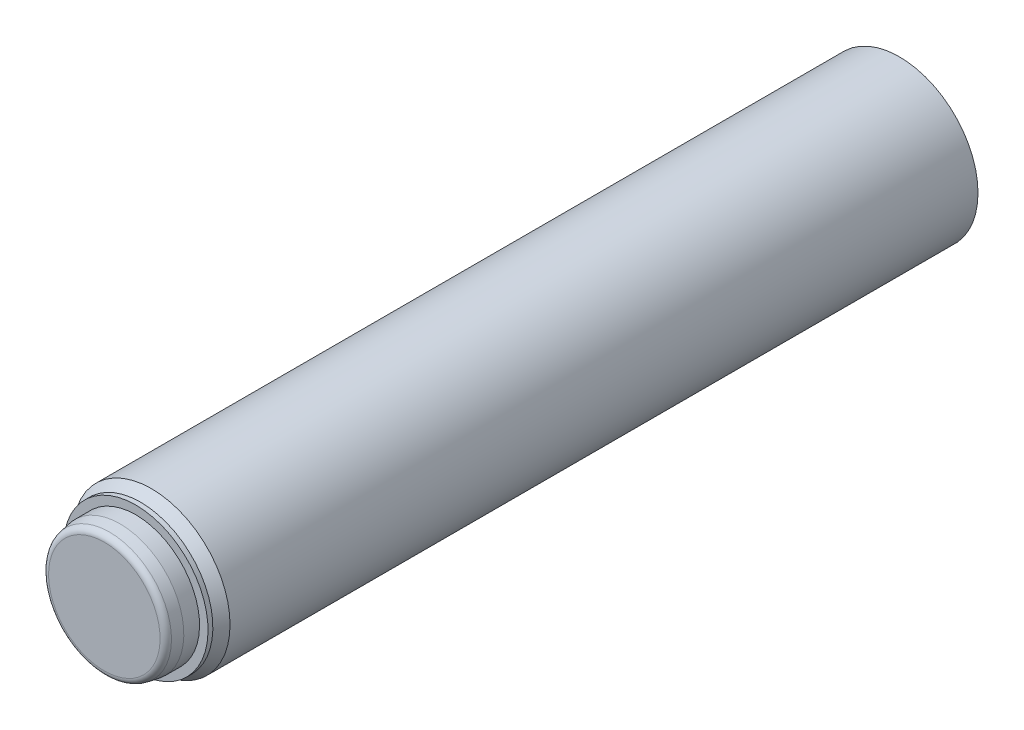
ISO-10303-21;
HEADER;
FILE_DESCRIPTION(('STEP AP214'),'2;1');
FILE_NAME('part.step','',(''),(''),'','','');
FILE_SCHEMA(('AUTOMOTIVE_DESIGN { 1 0 10303 214 1 1 1 1 }'));
ENDSEC;
DATA;
#1=APPLICATION_CONTEXT('core data for automotive mechanical design processes');
#2=APPLICATION_PROTOCOL_DEFINITION('international standard','automotive_design',2000,#1);
#3=PRODUCT_CONTEXT('',#1,'mechanical');
#4=PRODUCT('Part','Part','',(#3));
#5=PRODUCT_RELATED_PRODUCT_CATEGORY('part','',(#4));
#6=PRODUCT_DEFINITION_FORMATION('','',#4);
#7=PRODUCT_DEFINITION_CONTEXT('part definition',#1,'design');
#8=PRODUCT_DEFINITION('design','',#6,#7);
#9=PRODUCT_DEFINITION_SHAPE('','',#8);
#10=(LENGTH_UNIT() NAMED_UNIT(*) SI_UNIT(.MILLI.,.METRE.));
#11=(NAMED_UNIT(*) PLANE_ANGLE_UNIT() SI_UNIT($,.RADIAN.));
#12=(NAMED_UNIT(*) SI_UNIT($,.STERADIAN.) SOLID_ANGLE_UNIT());
#13=UNCERTAINTY_MEASURE_WITH_UNIT(LENGTH_MEASURE(1.E-05),#10,'distance_accuracy_value','');
#14=(GEOMETRIC_REPRESENTATION_CONTEXT(3) GLOBAL_UNCERTAINTY_ASSIGNED_CONTEXT((#13)) GLOBAL_UNIT_ASSIGNED_CONTEXT((#10,
#11,#12)) REPRESENTATION_CONTEXT('',''));
#15=CARTESIAN_POINT('',(0.,0.,0.));
#16=DIRECTION('',(0.,0.,1.));
#17=DIRECTION('',(1.,0.,0.));
#18=AXIS2_PLACEMENT_3D('',#15,#16,#17);
#19=CARTESIAN_POINT('',(0.,0.,119.));
#20=DIRECTION('',(0.,0.,-1.));
#21=DIRECTION('',(-1.,0.,0.));
#22=AXIS2_PLACEMENT_3D('',#19,#20,#21);
#23=CYLINDRICAL_SURFACE('',#22,12.5);
#24=CARTESIAN_POINT('',(0.,0.,119.));
#25=DIRECTION('',(0.,0.,1.));
#26=DIRECTION('',(1.,0.,0.));
#27=AXIS2_PLACEMENT_3D('',#24,#25,#26);
#28=CIRCLE('',#27,12.5);
#29=CARTESIAN_POINT('',(12.5,0.,119.));
#30=VERTEX_POINT('',#29);
#31=EDGE_CURVE('E10',#30,#30,#28,.T.);
#32=ORIENTED_EDGE('',*,*,#31,.F.);
#33=EDGE_LOOP('',(#32));
#34=FACE_BOUND('',#33,.T.);
#35=CARTESIAN_POINT('',(0.,0.,0.));
#36=DIRECTION('',(0.,0.,1.));
#37=DIRECTION('',(1.,0.,0.));
#38=AXIS2_PLACEMENT_3D('',#35,#36,#37);
#39=CIRCLE('',#38,12.5);
#40=CARTESIAN_POINT('',(12.5,0.,0.));
#41=VERTEX_POINT('',#40);
#42=EDGE_CURVE('E34',#41,#41,#39,.T.);
#43=ORIENTED_EDGE('',*,*,#42,.T.);
#44=EDGE_LOOP('',(#43));
#45=FACE_BOUND('',#44,.T.);
#46=ADVANCED_FACE('F31',(#34,#45),#23,.T.);
#47=CARTESIAN_POINT('',(0.,0.,0.));
#48=DIRECTION('',(0.,0.,1.));
#49=DIRECTION('',(1.,0.,0.));
#50=AXIS2_PLACEMENT_3D('',#47,#48,#49);
#51=PLANE('',#50);
#52=CARTESIAN_POINT('',(0.,0.,0.));
#53=DIRECTION('',(0.,0.,-1.));
#54=DIRECTION('',(-1.,0.,0.));
#55=AXIS2_PLACEMENT_3D('',#52,#53,#54);
#56=CIRCLE('',#55,6.);
#57=CARTESIAN_POINT('',(-6.,0.,0.));
#58=VERTEX_POINT('',#57);
#59=EDGE_CURVE('E61',#58,#58,#56,.T.);
#60=ORIENTED_EDGE('',*,*,#59,.F.);
#61=EDGE_LOOP('',(#60));
#62=FACE_BOUND('',#61,.T.);
#63=ORIENTED_EDGE('',*,*,#42,.F.);
#64=EDGE_LOOP('',(#63));
#65=FACE_BOUND('',#64,.T.);
#66=ADVANCED_FACE('F76',(#62,#65),#51,.F.);
#67=CARTESIAN_POINT('',(0.,0.,126.5));
#68=DIRECTION('',(0.,0.,-1.));
#69=DIRECTION('',(0.,1.,0.));
#70=AXIS2_PLACEMENT_3D('',#67,#68,#69);
#71=PLANE('',#70);
#72=CARTESIAN_POINT('',(0.,0.,126.5));
#73=DIRECTION('',(0.,0.,-1.));
#74=DIRECTION('',(0.,1.,0.));
#75=AXIS2_PLACEMENT_3D('',#72,#73,#74);
#76=CIRCLE('',#75,8.87008291705156);
#77=CARTESIAN_POINT('',(0.,8.87008291705155,126.5));
#78=VERTEX_POINT('',#77);
#79=EDGE_CURVE('E41',#78,#78,#76,.T.);
#80=ORIENTED_EDGE('',*,*,#79,.F.);
#81=EDGE_LOOP('',(#80));
#82=FACE_BOUND('',#81,.T.);
#83=ADVANCED_FACE('F79',(#82),#71,.F.);
#84=CARTESIAN_POINT('',(0.,0.,125.5));
#85=DIRECTION('',(0.,0.,-1.));
#86=DIRECTION('',(0.,1.,0.));
#87=AXIS2_PLACEMENT_3D('',#84,#85,#86);
#88=TOROIDAL_SURFACE('',#87,8.87008291705156,1.);
#89=CARTESIAN_POINT('',(0.,0.,125.673648177667));
#90=DIRECTION('',(0.,0.,-1.));
#91=DIRECTION('',(0.,1.,0.));
#92=AXIS2_PLACEMENT_3D('',#89,#90,#91);
#93=CIRCLE('',#92,9.85489067006377);
#94=CARTESIAN_POINT('',(0.,9.85489067006377,125.673648177667));
#95=VERTEX_POINT('',#94);
#96=EDGE_CURVE('E45',#95,#95,#93,.T.);
#97=ORIENTED_EDGE('',*,*,#96,.F.);
#98=EDGE_LOOP('',(#97));
#99=FACE_BOUND('',#98,.T.);
#100=ORIENTED_EDGE('',*,*,#79,.T.);
#101=EDGE_LOOP('',(#100));
#102=FACE_BOUND('',#101,.T.);
#103=ADVANCED_FACE('F98',(#99,#102),#88,.T.);
#104=CARTESIAN_POINT('',(0.,0.,125.673648177667));
#105=DIRECTION('',(0.,0.,-1.));
#106=DIRECTION('',(0.,1.,0.));
#107=AXIS2_PLACEMENT_3D('',#104,#105,#106);
#108=CONICAL_SURFACE('',#107,9.85489067006377,0.174532925199432);
#109=CARTESIAN_POINT('',(0.,0.,124.));
#110=DIRECTION('',(0.,0.,-1.));
#111=DIRECTION('',(0.,1.,0.));
#112=AXIS2_PLACEMENT_3D('',#109,#110,#111);
#113=CIRCLE('',#112,10.15);
#114=CARTESIAN_POINT('',(0.,10.15,124.));
#115=VERTEX_POINT('',#114);
#116=EDGE_CURVE('E48',#115,#115,#113,.T.);
#117=ORIENTED_EDGE('',*,*,#116,.F.);
#118=EDGE_LOOP('',(#117));
#119=FACE_BOUND('',#118,.T.);
#120=ORIENTED_EDGE('',*,*,#96,.T.);
#121=EDGE_LOOP('',(#120));
#122=FACE_BOUND('',#121,.T.);
#123=ADVANCED_FACE('F106',(#119,#122),#108,.T.);
#124=CARTESIAN_POINT('',(0.,0.,119.));
#125=DIRECTION('',(0.,0.,-1.));
#126=DIRECTION('',(0.,1.,0.));
#127=AXIS2_PLACEMENT_3D('',#124,#125,#126);
#128=CYLINDRICAL_SURFACE('',#127,10.15);
#129=CARTESIAN_POINT('',(0.,0.,121.5));
#130=DIRECTION('',(0.,0.,-1.));
#131=DIRECTION('',(0.,1.,0.));
#132=AXIS2_PLACEMENT_3D('',#129,#130,#131);
#133=CIRCLE('',#132,10.15);
#134=CARTESIAN_POINT('',(0.,10.15,121.5));
#135=VERTEX_POINT('',#134);
#136=EDGE_CURVE('E51',#135,#135,#133,.T.);
#137=ORIENTED_EDGE('',*,*,#136,.F.);
#138=EDGE_LOOP('',(#137));
#139=FACE_BOUND('',#138,.T.);
#140=ORIENTED_EDGE('',*,*,#116,.T.);
#141=EDGE_LOOP('',(#140));
#142=FACE_BOUND('',#141,.T.);
#143=ADVANCED_FACE('F114',(#139,#142),#128,.T.);
#144=CARTESIAN_POINT('',(0.,-10.15,121.5));
#145=DIRECTION('',(0.,0.,-1.));
#146=DIRECTION('',(0.,1.,0.));
#147=AXIS2_PLACEMENT_3D('',#144,#145,#146);
#148=PLANE('',#147);
#149=CARTESIAN_POINT('',(0.,0.,121.5));
#150=DIRECTION('',(0.,0.,-1.));
#151=DIRECTION('',(0.,1.,0.));
#152=AXIS2_PLACEMENT_3D('',#149,#150,#151);
#153=CIRCLE('',#152,11.5);
#154=CARTESIAN_POINT('',(0.,11.5,121.5));
#155=VERTEX_POINT('',#154);
#156=EDGE_CURVE('E54',#155,#155,#153,.T.);
#157=ORIENTED_EDGE('',*,*,#156,.F.);
#158=EDGE_LOOP('',(#157));
#159=FACE_BOUND('',#158,.T.);
#160=ORIENTED_EDGE('',*,*,#136,.T.);
#161=EDGE_LOOP('',(#160));
#162=FACE_BOUND('',#161,.T.);
#163=ADVANCED_FACE('F122',(#159,#162),#148,.F.);
#164=CARTESIAN_POINT('',(0.,0.,119.));
#165=DIRECTION('',(0.,0.,-1.));
#166=DIRECTION('',(0.,1.,0.));
#167=AXIS2_PLACEMENT_3D('',#164,#165,#166);
#168=CYLINDRICAL_SURFACE('',#167,11.5);
#169=CARTESIAN_POINT('',(0.,0.,120.732050807569));
#170=DIRECTION('',(0.,0.,-1.));
#171=DIRECTION('',(0.,1.,0.));
#172=AXIS2_PLACEMENT_3D('',#169,#170,#171);
#173=CIRCLE('',#172,11.5);
#174=CARTESIAN_POINT('',(0.,11.5,120.732050807569));
#175=VERTEX_POINT('',#174);
#176=EDGE_CURVE('E57',#175,#175,#173,.T.);
#177=ORIENTED_EDGE('',*,*,#176,.F.);
#178=EDGE_LOOP('',(#177));
#179=FACE_BOUND('',#178,.T.);
#180=ORIENTED_EDGE('',*,*,#156,.T.);
#181=EDGE_LOOP('',(#180));
#182=FACE_BOUND('',#181,.T.);
#183=ADVANCED_FACE('F130',(#179,#182),#168,.T.);
#184=CARTESIAN_POINT('',(0.,0.,120.732050807569));
#185=DIRECTION('',(0.,0.,-1.));
#186=DIRECTION('',(0.,1.,0.));
#187=AXIS2_PLACEMENT_3D('',#184,#185,#186);
#188=CONICAL_SURFACE('',#187,11.5,0.523598775598297);
#189=ORIENTED_EDGE('',*,*,#31,.T.);
#190=EDGE_LOOP('',(#189));
#191=FACE_BOUND('',#190,.T.);
#192=ORIENTED_EDGE('',*,*,#176,.T.);
#193=EDGE_LOOP('',(#192));
#194=FACE_BOUND('',#193,.T.);
#195=ADVANCED_FACE('F72',(#191,#194),#188,.T.);
#196=CARTESIAN_POINT('',(0.,0.,30.));
#197=DIRECTION('',(0.,0.,-1.));
#198=DIRECTION('',(-1.,0.,0.));
#199=AXIS2_PLACEMENT_3D('',#196,#197,#198);
#200=CYLINDRICAL_SURFACE('',#199,6.);
#201=CARTESIAN_POINT('',(0.,0.,30.));
#202=DIRECTION('',(0.,0.,-1.));
#203=DIRECTION('',(-1.,0.,0.));
#204=AXIS2_PLACEMENT_3D('',#201,#202,#203);
#205=CIRCLE('',#204,6.);
#206=CARTESIAN_POINT('',(-6.,0.,30.));
#207=VERTEX_POINT('',#206);
#208=EDGE_CURVE('E60',#207,#207,#205,.T.);
#209=ORIENTED_EDGE('',*,*,#208,.F.);
#210=EDGE_LOOP('',(#209));
#211=FACE_BOUND('',#210,.T.);
#212=ORIENTED_EDGE('',*,*,#59,.T.);
#213=EDGE_LOOP('',(#212));
#214=FACE_BOUND('',#213,.T.);
#215=ADVANCED_FACE('F69',(#211,#214),#200,.F.);
#216=CARTESIAN_POINT('',(0.,0.,30.));
#217=DIRECTION('',(0.,0.,-1.));
#218=DIRECTION('',(-1.,0.,0.));
#219=AXIS2_PLACEMENT_3D('',#216,#217,#218);
#220=PLANE('',#219);
#221=ORIENTED_EDGE('',*,*,#208,.T.);
#222=EDGE_LOOP('',(#221));
#223=FACE_BOUND('',#222,.T.);
#224=ADVANCED_FACE('F67',(#223),#220,.T.);
#225=CLOSED_SHELL('',(#46,#66,#83,#103,#123,#143,#163,#183,#195,#215,#224));
#226=MANIFOLD_SOLID_BREP('B2',#225);
#227=ADVANCED_BREP_SHAPE_REPRESENTATION('',(#18,#226),#14);
#228=SHAPE_DEFINITION_REPRESENTATION(#9,#227);
ENDSEC;
END-ISO-10303-21;
